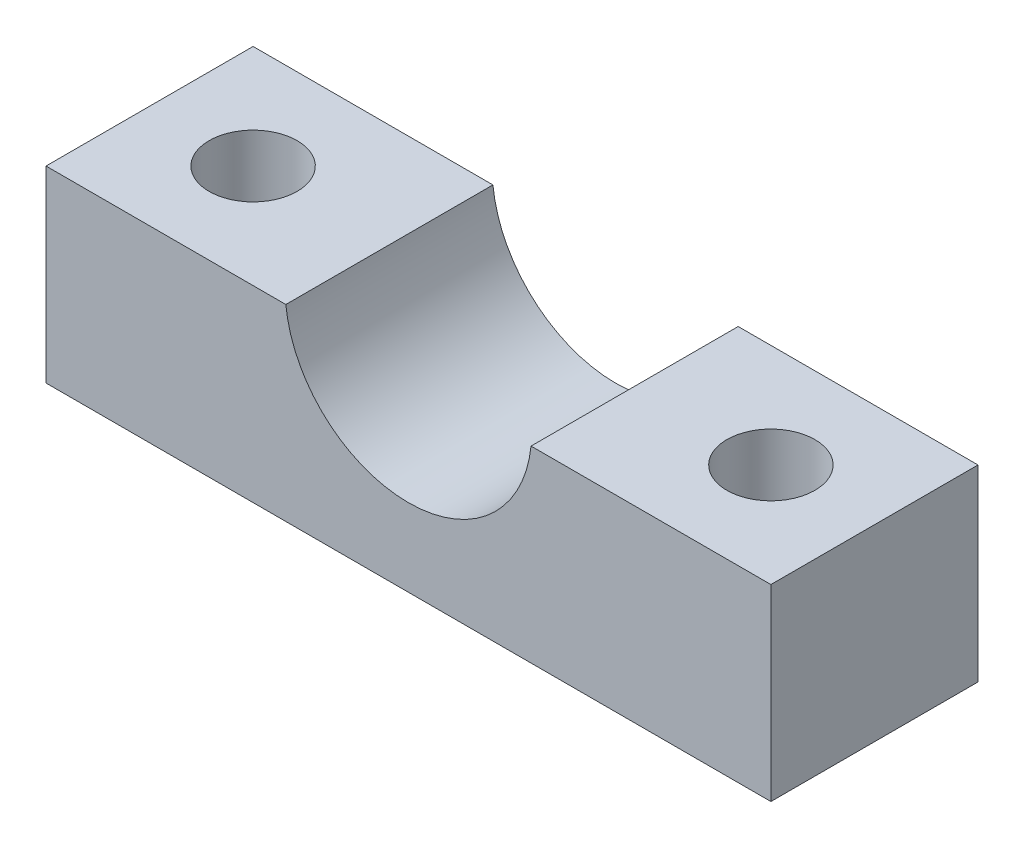
ISO-10303-21;
HEADER;
FILE_DESCRIPTION(('STEP AP214'),'2;1');
FILE_NAME('part.step','',(''),(''),'','','');
FILE_SCHEMA(('AUTOMOTIVE_DESIGN { 1 0 10303 214 1 1 1 1 }'));
ENDSEC;
DATA;
#1=APPLICATION_CONTEXT('core data for automotive mechanical design processes');
#2=APPLICATION_PROTOCOL_DEFINITION('international standard','automotive_design',2000,#1);
#3=PRODUCT_CONTEXT('',#1,'mechanical');
#4=PRODUCT('Part','Part','',(#3));
#5=PRODUCT_RELATED_PRODUCT_CATEGORY('part','',(#4));
#6=PRODUCT_DEFINITION_FORMATION('','',#4);
#7=PRODUCT_DEFINITION_CONTEXT('part definition',#1,'design');
#8=PRODUCT_DEFINITION('design','',#6,#7);
#9=PRODUCT_DEFINITION_SHAPE('','',#8);
#10=(LENGTH_UNIT() NAMED_UNIT(*) SI_UNIT(.MILLI.,.METRE.));
#11=(NAMED_UNIT(*) PLANE_ANGLE_UNIT() SI_UNIT($,.RADIAN.));
#12=(NAMED_UNIT(*) SI_UNIT($,.STERADIAN.) SOLID_ANGLE_UNIT());
#13=UNCERTAINTY_MEASURE_WITH_UNIT(LENGTH_MEASURE(1.E-05),#10,'distance_accuracy_value','');
#14=(GEOMETRIC_REPRESENTATION_CONTEXT(3) GLOBAL_UNCERTAINTY_ASSIGNED_CONTEXT((#13)) GLOBAL_UNIT_ASSIGNED_CONTEXT((#10,
#11,#12)) REPRESENTATION_CONTEXT('',''));
#15=CARTESIAN_POINT('',(0.,0.,0.));
#16=DIRECTION('',(0.,0.,1.));
#17=DIRECTION('',(1.,0.,0.));
#18=AXIS2_PLACEMENT_3D('',#15,#16,#17);
#19=CARTESIAN_POINT('',(10.,-7.76,0.));
#20=DIRECTION('',(0.,-1.,0.));
#21=DIRECTION('',(0.,0.,-1.));
#22=AXIS2_PLACEMENT_3D('',#19,#20,#21);
#23=CYLINDRICAL_SURFACE('',#22,1.69999999999999);
#24=CARTESIAN_POINT('',(10.,-0.499999999999995,0.));
#25=DIRECTION('',(0.,-1.,0.));
#26=DIRECTION('',(0.,0.,-1.));
#27=AXIS2_PLACEMENT_3D('',#24,#25,#26);
#28=CIRCLE('',#27,1.7);
#29=CARTESIAN_POINT('',(10.,-0.499999999999995,-1.7));
#30=VERTEX_POINT('',#29);
#31=EDGE_CURVE('E263',#30,#30,#28,.T.);
#32=ORIENTED_EDGE('',*,*,#31,.F.);
#33=EDGE_LOOP('',(#32));
#34=FACE_BOUND('',#33,.T.);
#35=CARTESIAN_POINT('',(10.,-4.76,0.));
#36=DIRECTION('',(0.,-1.,0.));
#37=DIRECTION('',(0.,0.,-1.));
#38=AXIS2_PLACEMENT_3D('',#35,#36,#37);
#39=CIRCLE('',#38,1.69999999999999);
#40=CARTESIAN_POINT('',(10.,-4.76,-1.69999999999999));
#41=VERTEX_POINT('',#40);
#42=EDGE_CURVE('E35',#41,#41,#39,.F.);
#43=ORIENTED_EDGE('',*,*,#42,.F.);
#44=EDGE_LOOP('',(#43));
#45=FACE_BOUND('',#44,.T.);
#46=ADVANCED_FACE('F31',(#34,#45),#23,.F.);
#47=CARTESIAN_POINT('',(-10.,-7.76,0.));
#48=DIRECTION('',(0.,-1.,0.));
#49=DIRECTION('',(0.,0.,-1.));
#50=AXIS2_PLACEMENT_3D('',#47,#48,#49);
#51=CYLINDRICAL_SURFACE('',#50,1.69999999999999);
#52=CARTESIAN_POINT('',(-10.,-0.499999999999997,0.));
#53=DIRECTION('',(0.,-1.,0.));
#54=DIRECTION('',(0.,0.,-1.));
#55=AXIS2_PLACEMENT_3D('',#52,#53,#54);
#56=CIRCLE('',#55,1.7);
#57=CARTESIAN_POINT('',(-10.,-0.499999999999997,-1.7));
#58=VERTEX_POINT('',#57);
#59=EDGE_CURVE('E260',#58,#58,#56,.T.);
#60=ORIENTED_EDGE('',*,*,#59,.F.);
#61=EDGE_LOOP('',(#60));
#62=FACE_BOUND('',#61,.T.);
#63=CARTESIAN_POINT('',(-10.,-4.76,0.));
#64=DIRECTION('',(0.,-1.,0.));
#65=DIRECTION('',(0.,0.,-1.));
#66=AXIS2_PLACEMENT_3D('',#63,#64,#65);
#67=CIRCLE('',#66,1.69999999999999);
#68=CARTESIAN_POINT('',(-10.,-4.76,-1.69999999999999));
#69=VERTEX_POINT('',#68);
#70=EDGE_CURVE('E250',#69,#69,#67,.F.);
#71=ORIENTED_EDGE('',*,*,#70,.F.);
#72=EDGE_LOOP('',(#71));
#73=FACE_BOUND('',#72,.T.);
#74=ADVANCED_FACE('F310',(#62,#73),#51,.F.);
#75=CARTESIAN_POINT('',(14.,-0.499999999999998,4.));
#76=DIRECTION('',(-1.,0.,0.));
#77=DIRECTION('',(0.,-1.,0.));
#78=AXIS2_PLACEMENT_3D('',#75,#76,#77);
#79=PLANE('',#78);
#80=DIRECTION('',(0.,1.,0.));
#81=VECTOR('',#80,1.);
#82=CARTESIAN_POINT('',(14.,-0.499999999999998,-4.));
#83=LINE('',#82,#81);
#84=CARTESIAN_POINT('',(14.,-7.76,-4.));
#85=VERTEX_POINT('',#84);
#86=CARTESIAN_POINT('',(14.,-0.499999999999998,-4.));
#87=VERTEX_POINT('',#86);
#88=EDGE_CURVE('E266',#85,#87,#83,.T.);
#89=ORIENTED_EDGE('',*,*,#88,.T.);
#90=DIRECTION('',(0.,0.,-1.));
#91=VECTOR('',#90,1.);
#92=CARTESIAN_POINT('',(14.,-0.499999999999998,4.));
#93=LINE('',#92,#91);
#94=CARTESIAN_POINT('',(14.,-0.499999999999998,4.));
#95=VERTEX_POINT('',#94);
#96=EDGE_CURVE('E11',#95,#87,#93,.T.);
#97=ORIENTED_EDGE('',*,*,#96,.F.);
#98=DIRECTION('',(0.,1.,0.));
#99=VECTOR('',#98,1.);
#100=CARTESIAN_POINT('',(14.,-0.499999999999998,4.));
#101=LINE('',#100,#99);
#102=CARTESIAN_POINT('',(14.,-7.76,4.));
#103=VERTEX_POINT('',#102);
#104=EDGE_CURVE('E267',#103,#95,#101,.T.);
#105=ORIENTED_EDGE('',*,*,#104,.F.);
#106=DIRECTION('',(0.,0.,-1.));
#107=VECTOR('',#106,1.);
#108=CARTESIAN_POINT('',(14.,-7.76,4.));
#109=LINE('',#108,#107);
#110=EDGE_CURVE('E281',#103,#85,#109,.T.);
#111=ORIENTED_EDGE('',*,*,#110,.T.);
#112=EDGE_LOOP('',(#89,#97,#105,#111));
#113=FACE_BOUND('',#112,.T.);
#114=ADVANCED_FACE('F33',(#113),#79,.F.);
#115=CARTESIAN_POINT('',(14.,-0.499999999999998,4.));
#116=DIRECTION('',(0.,-1.,0.));
#117=DIRECTION('',(1.,0.,0.));
#118=AXIS2_PLACEMENT_3D('',#115,#116,#117);
#119=PLANE('',#118);
#120=ORIENTED_EDGE('',*,*,#31,.T.);
#121=EDGE_LOOP('',(#120));
#122=FACE_BOUND('',#121,.T.);
#123=DIRECTION('',(-1.,0.,0.));
#124=VECTOR('',#123,1.);
#125=CARTESIAN_POINT('',(14.,-0.499999999999998,-4.));
#126=LINE('',#125,#124);
#127=CARTESIAN_POINT('',(4.73618055504644,-0.499999999999999,-4.));
#128=VERTEX_POINT('',#127);
#129=EDGE_CURVE('E284',#87,#128,#126,.T.);
#130=ORIENTED_EDGE('',*,*,#129,.T.);
#131=DIRECTION('',(0.,0.,-1.));
#132=VECTOR('',#131,1.);
#133=CARTESIAN_POINT('',(4.73618055504644,-0.499999999999999,4.));
#134=LINE('',#133,#132);
#135=CARTESIAN_POINT('',(4.73618055504644,-0.499999999999999,4.));
#136=VERTEX_POINT('',#135);
#137=EDGE_CURVE('E40',#136,#128,#134,.T.);
#138=ORIENTED_EDGE('',*,*,#137,.F.);
#139=DIRECTION('',(-1.,0.,0.));
#140=VECTOR('',#139,1.);
#141=CARTESIAN_POINT('',(14.,-0.499999999999998,4.));
#142=LINE('',#141,#140);
#143=EDGE_CURVE('E270',#95,#136,#142,.T.);
#144=ORIENTED_EDGE('',*,*,#143,.F.);
#145=ORIENTED_EDGE('',*,*,#96,.T.);
#146=EDGE_LOOP('',(#130,#138,#144,#145));
#147=FACE_BOUND('',#146,.T.);
#148=ADVANCED_FACE('F318',(#122,#147),#119,.F.);
#149=CARTESIAN_POINT('',(0.,0.,4.));
#150=DIRECTION('',(0.,0.,-1.));
#151=DIRECTION('',(-1.,0.,0.));
#152=AXIS2_PLACEMENT_3D('',#149,#150,#151);
#153=CYLINDRICAL_SURFACE('',#152,4.7625);
#154=CARTESIAN_POINT('',(0.,0.,-4.));
#155=DIRECTION('',(0.,0.,-1.));
#156=DIRECTION('',(1.,0.,0.));
#157=AXIS2_PLACEMENT_3D('',#154,#155,#156);
#158=CIRCLE('',#157,4.7625);
#159=CARTESIAN_POINT('',(-4.73618055504644,-0.5,-4.));
#160=VERTEX_POINT('',#159);
#161=EDGE_CURVE('E286',#128,#160,#158,.T.);
#162=ORIENTED_EDGE('',*,*,#161,.T.);
#163=DIRECTION('',(0.,0.,-1.));
#164=VECTOR('',#163,1.);
#165=CARTESIAN_POINT('',(-4.73618055504644,-0.5,4.));
#166=LINE('',#165,#164);
#167=CARTESIAN_POINT('',(-4.73618055504644,-0.5,4.));
#168=VERTEX_POINT('',#167);
#169=EDGE_CURVE('E301',#168,#160,#166,.T.);
#170=ORIENTED_EDGE('',*,*,#169,.F.);
#171=CARTESIAN_POINT('',(0.,0.,4.));
#172=DIRECTION('',(0.,0.,-1.));
#173=DIRECTION('',(1.,0.,0.));
#174=AXIS2_PLACEMENT_3D('',#171,#172,#173);
#175=CIRCLE('',#174,4.7625);
#176=EDGE_CURVE('E273',#136,#168,#175,.T.);
#177=ORIENTED_EDGE('',*,*,#176,.F.);
#178=ORIENTED_EDGE('',*,*,#137,.T.);
#179=EDGE_LOOP('',(#162,#170,#177,#178));
#180=FACE_BOUND('',#179,.T.);
#181=ADVANCED_FACE('F346',(#180),#153,.F.);
#182=CARTESIAN_POINT('',(-4.73618055504644,-0.500000000000001,4.));
#183=DIRECTION('',(0.,-1.,0.));
#184=DIRECTION('',(1.,0.,0.));
#185=AXIS2_PLACEMENT_3D('',#182,#183,#184);
#186=PLANE('',#185);
#187=ORIENTED_EDGE('',*,*,#59,.T.);
#188=EDGE_LOOP('',(#187));
#189=FACE_BOUND('',#188,.T.);
#190=DIRECTION('',(-1.,0.,0.));
#191=VECTOR('',#190,1.);
#192=CARTESIAN_POINT('',(-4.73618055504644,-0.500000000000001,-4.));
#193=LINE('',#192,#191);
#194=CARTESIAN_POINT('',(-14.,-0.500000000000002,-4.));
#195=VERTEX_POINT('',#194);
#196=EDGE_CURVE('E288',#160,#195,#193,.T.);
#197=ORIENTED_EDGE('',*,*,#196,.T.);
#198=DIRECTION('',(0.,0.,-1.));
#199=VECTOR('',#198,1.);
#200=CARTESIAN_POINT('',(-14.,-0.500000000000002,4.));
#201=LINE('',#200,#199);
#202=CARTESIAN_POINT('',(-14.,-0.500000000000002,4.));
#203=VERTEX_POINT('',#202);
#204=EDGE_CURVE('E298',#203,#195,#201,.T.);
#205=ORIENTED_EDGE('',*,*,#204,.F.);
#206=DIRECTION('',(-1.,0.,0.));
#207=VECTOR('',#206,1.);
#208=CARTESIAN_POINT('',(-4.73618055504644,-0.500000000000001,4.));
#209=LINE('',#208,#207);
#210=EDGE_CURVE('E275',#168,#203,#209,.T.);
#211=ORIENTED_EDGE('',*,*,#210,.F.);
#212=ORIENTED_EDGE('',*,*,#169,.T.);
#213=EDGE_LOOP('',(#197,#205,#211,#212));
#214=FACE_BOUND('',#213,.T.);
#215=ADVANCED_FACE('F342',(#189,#214),#186,.F.);
#216=CARTESIAN_POINT('',(-14.,-0.500000000000002,4.));
#217=DIRECTION('',(1.,0.,0.));
#218=DIRECTION('',(0.,0.,-1.));
#219=AXIS2_PLACEMENT_3D('',#216,#217,#218);
#220=PLANE('',#219);
#221=DIRECTION('',(0.,-1.,0.));
#222=VECTOR('',#221,1.);
#223=CARTESIAN_POINT('',(-14.,-0.500000000000002,-4.));
#224=LINE('',#223,#222);
#225=CARTESIAN_POINT('',(-14.,-7.76,-4.));
#226=VERTEX_POINT('',#225);
#227=EDGE_CURVE('E290',#195,#226,#224,.T.);
#228=ORIENTED_EDGE('',*,*,#227,.T.);
#229=DIRECTION('',(0.,0.,-1.));
#230=VECTOR('',#229,1.);
#231=CARTESIAN_POINT('',(-14.,-7.76,4.));
#232=LINE('',#231,#230);
#233=CARTESIAN_POINT('',(-14.,-7.76,4.));
#234=VERTEX_POINT('',#233);
#235=EDGE_CURVE('E295',#234,#226,#232,.T.);
#236=ORIENTED_EDGE('',*,*,#235,.F.);
#237=DIRECTION('',(0.,-1.,0.));
#238=VECTOR('',#237,1.);
#239=CARTESIAN_POINT('',(-14.,-0.500000000000002,4.));
#240=LINE('',#239,#238);
#241=EDGE_CURVE('E277',#203,#234,#240,.T.);
#242=ORIENTED_EDGE('',*,*,#241,.F.);
#243=ORIENTED_EDGE('',*,*,#204,.T.);
#244=EDGE_LOOP('',(#228,#236,#242,#243));
#245=FACE_BOUND('',#244,.T.);
#246=ADVANCED_FACE('F338',(#245),#220,.F.);
#247=CARTESIAN_POINT('',(14.,-7.76,4.));
#248=DIRECTION('',(0.,1.,0.));
#249=DIRECTION('',(-1.,0.,0.));
#250=AXIS2_PLACEMENT_3D('',#247,#248,#249);
#251=PLANE('',#250);
#252=DIRECTION('',(0.866025403784439,0.,-0.5));
#253=VECTOR('',#252,1.);
#254=CARTESIAN_POINT('',(7.25,-7.76,-1.58771324027147));
#255=LINE('',#254,#253);
#256=CARTESIAN_POINT('',(7.25,-7.76,-1.58771324027147));
#257=VERTEX_POINT('',#256);
#258=CARTESIAN_POINT('',(10.,-7.76,-3.17542648054294));
#259=VERTEX_POINT('',#258);
#260=EDGE_CURVE('E194',#257,#259,#255,.T.);
#261=ORIENTED_EDGE('',*,*,#260,.F.);
#262=DIRECTION('',(0.,0.,-1.));
#263=VECTOR('',#262,1.);
#264=CARTESIAN_POINT('',(7.25,-7.76,1.58771324027147));
#265=LINE('',#264,#263);
#266=CARTESIAN_POINT('',(7.25,-7.76,1.58771324027147));
#267=VERTEX_POINT('',#266);
#268=EDGE_CURVE('E48',#267,#257,#265,.T.);
#269=ORIENTED_EDGE('',*,*,#268,.F.);
#270=DIRECTION('',(-0.866025403784438,0.,-0.5));
#271=VECTOR('',#270,1.);
#272=CARTESIAN_POINT('',(10.,-7.76,3.17542648054294));
#273=LINE('',#272,#271);
#274=CARTESIAN_POINT('',(10.,-7.76,3.17542648054294));
#275=VERTEX_POINT('',#274);
#276=EDGE_CURVE('E180',#275,#267,#273,.T.);
#277=ORIENTED_EDGE('',*,*,#276,.F.);
#278=DIRECTION('',(-0.866025403784439,0.,0.5));
#279=VECTOR('',#278,1.);
#280=CARTESIAN_POINT('',(12.75,-7.76,1.58771324027147));
#281=LINE('',#280,#279);
#282=CARTESIAN_POINT('',(12.75,-7.76,1.58771324027147));
#283=VERTEX_POINT('',#282);
#284=EDGE_CURVE('E183',#283,#275,#281,.T.);
#285=ORIENTED_EDGE('',*,*,#284,.F.);
#286=DIRECTION('',(0.,0.,1.));
#287=VECTOR('',#286,1.);
#288=CARTESIAN_POINT('',(12.75,-7.76,-1.58771324027147));
#289=LINE('',#288,#287);
#290=CARTESIAN_POINT('',(12.75,-7.76,-1.58771324027147));
#291=VERTEX_POINT('',#290);
#292=EDGE_CURVE('E199',#291,#283,#289,.T.);
#293=ORIENTED_EDGE('',*,*,#292,.F.);
#294=DIRECTION('',(0.866025403784439,0.,0.5));
#295=VECTOR('',#294,1.);
#296=CARTESIAN_POINT('',(10.,-7.76,-3.17542648054294));
#297=LINE('',#296,#295);
#298=EDGE_CURVE('E196',#259,#291,#297,.T.);
#299=ORIENTED_EDGE('',*,*,#298,.F.);
#300=EDGE_LOOP('',(#261,#269,#277,#285,#293,#299));
#301=FACE_BOUND('',#300,.T.);
#302=DIRECTION('',(0.,0.,1.));
#303=VECTOR('',#302,1.);
#304=CARTESIAN_POINT('',(-7.25,-7.76,-1.58771324027147));
#305=LINE('',#304,#303);
#306=CARTESIAN_POINT('',(-7.25,-7.76,-1.58771324027147));
#307=VERTEX_POINT('',#306);
#308=CARTESIAN_POINT('',(-7.25,-7.76,1.58771324027147));
#309=VERTEX_POINT('',#308);
#310=EDGE_CURVE('E234',#307,#309,#305,.T.);
#311=ORIENTED_EDGE('',*,*,#310,.F.);
#312=DIRECTION('',(0.866025403784438,0.,0.5));
#313=VECTOR('',#312,1.);
#314=CARTESIAN_POINT('',(-10.,-7.76,-3.17542648054294));
#315=LINE('',#314,#313);
#316=CARTESIAN_POINT('',(-10.,-7.76,-3.17542648054294));
#317=VERTEX_POINT('',#316);
#318=EDGE_CURVE('E56',#317,#307,#315,.T.);
#319=ORIENTED_EDGE('',*,*,#318,.F.);
#320=DIRECTION('',(0.866025403784438,0.,-0.5));
#321=VECTOR('',#320,1.);
#322=CARTESIAN_POINT('',(-12.75,-7.76,-1.58771324027147));
#323=LINE('',#322,#321);
#324=CARTESIAN_POINT('',(-12.75,-7.76,-1.58771324027147));
#325=VERTEX_POINT('',#324);
#326=EDGE_CURVE('E217',#325,#317,#323,.T.);
#327=ORIENTED_EDGE('',*,*,#326,.F.);
#328=DIRECTION('',(0.,0.,-1.));
#329=VECTOR('',#328,1.);
#330=CARTESIAN_POINT('',(-12.75,-7.76,1.58771324027147));
#331=LINE('',#330,#329);
#332=CARTESIAN_POINT('',(-12.75,-7.76,1.58771324027147));
#333=VERTEX_POINT('',#332);
#334=EDGE_CURVE('E243',#333,#325,#331,.T.);
#335=ORIENTED_EDGE('',*,*,#334,.F.);
#336=DIRECTION('',(-0.866025403784438,0.,-0.5));
#337=VECTOR('',#336,1.);
#338=CARTESIAN_POINT('',(-10.,-7.76,3.17542648054294));
#339=LINE('',#338,#337);
#340=CARTESIAN_POINT('',(-10.,-7.76,3.17542648054294));
#341=VERTEX_POINT('',#340);
#342=EDGE_CURVE('E240',#341,#333,#339,.T.);
#343=ORIENTED_EDGE('',*,*,#342,.F.);
#344=DIRECTION('',(-0.866025403784438,0.,0.5));
#345=VECTOR('',#344,1.);
#346=CARTESIAN_POINT('',(-7.25,-7.76,1.58771324027147));
#347=LINE('',#346,#345);
#348=EDGE_CURVE('E237',#309,#341,#347,.T.);
#349=ORIENTED_EDGE('',*,*,#348,.F.);
#350=EDGE_LOOP('',(#311,#319,#327,#335,#343,#349));
#351=FACE_BOUND('',#350,.T.);
#352=DIRECTION('',(1.,0.,0.));
#353=VECTOR('',#352,1.);
#354=CARTESIAN_POINT('',(14.,-7.76,-4.));
#355=LINE('',#354,#353);
#356=EDGE_CURVE('E271',#226,#85,#355,.T.);
#357=ORIENTED_EDGE('',*,*,#356,.T.);
#358=ORIENTED_EDGE('',*,*,#110,.F.);
#359=DIRECTION('',(1.,0.,0.));
#360=VECTOR('',#359,1.);
#361=CARTESIAN_POINT('',(14.,-7.76,4.));
#362=LINE('',#361,#360);
#363=EDGE_CURVE('E279',#234,#103,#362,.T.);
#364=ORIENTED_EDGE('',*,*,#363,.F.);
#365=ORIENTED_EDGE('',*,*,#235,.T.);
#366=EDGE_LOOP('',(#357,#358,#364,#365));
#367=FACE_BOUND('',#366,.T.);
#368=ADVANCED_FACE('F331',(#301,#351,#367),#251,.F.);
#369=CARTESIAN_POINT('',(0.,0.,4.));
#370=DIRECTION('',(0.,0.,1.));
#371=DIRECTION('',(1.,0.,0.));
#372=AXIS2_PLACEMENT_3D('',#369,#370,#371);
#373=PLANE('',#372);
#374=ORIENTED_EDGE('',*,*,#104,.T.);
#375=ORIENTED_EDGE('',*,*,#143,.T.);
#376=ORIENTED_EDGE('',*,*,#176,.T.);
#377=ORIENTED_EDGE('',*,*,#210,.T.);
#378=ORIENTED_EDGE('',*,*,#241,.T.);
#379=ORIENTED_EDGE('',*,*,#363,.T.);
#380=EDGE_LOOP('',(#374,#375,#376,#377,#378,#379));
#381=FACE_BOUND('',#380,.T.);
#382=ADVANCED_FACE('F327',(#381),#373,.T.);
#383=CARTESIAN_POINT('',(0.,0.,-4.));
#384=DIRECTION('',(0.,0.,1.));
#385=DIRECTION('',(1.,0.,0.));
#386=AXIS2_PLACEMENT_3D('',#383,#384,#385);
#387=PLANE('',#386);
#388=ORIENTED_EDGE('',*,*,#88,.F.);
#389=ORIENTED_EDGE('',*,*,#356,.F.);
#390=ORIENTED_EDGE('',*,*,#227,.F.);
#391=ORIENTED_EDGE('',*,*,#196,.F.);
#392=ORIENTED_EDGE('',*,*,#161,.F.);
#393=ORIENTED_EDGE('',*,*,#129,.F.);
#394=EDGE_LOOP('',(#388,#389,#390,#391,#392,#393));
#395=FACE_BOUND('',#394,.T.);
#396=ADVANCED_FACE('F330',(#395),#387,.F.);
#397=CARTESIAN_POINT('',(-7.25,-4.76,-1.58771324027147));
#398=DIRECTION('',(0.,-1.,0.));
#399=DIRECTION('',(0.,0.,-1.));
#400=AXIS2_PLACEMENT_3D('',#397,#398,#399);
#401=PLANE('',#400);
#402=DIRECTION('',(0.866025403784438,0.,0.5));
#403=VECTOR('',#402,1.);
#404=CARTESIAN_POINT('',(-10.,-4.76,-3.17542648054294));
#405=LINE('',#404,#403);
#406=CARTESIAN_POINT('',(-10.,-4.76,-3.17542648054294));
#407=VERTEX_POINT('',#406);
#408=CARTESIAN_POINT('',(-7.25,-4.76,-1.58771324027147));
#409=VERTEX_POINT('',#408);
#410=EDGE_CURVE('E213',#407,#409,#405,.T.);
#411=ORIENTED_EDGE('',*,*,#410,.T.);
#412=DIRECTION('',(0.,0.,1.));
#413=VECTOR('',#412,1.);
#414=CARTESIAN_POINT('',(-7.25,-4.76,-1.58771324027147));
#415=LINE('',#414,#413);
#416=CARTESIAN_POINT('',(-7.25,-4.76,1.58771324027147));
#417=VERTEX_POINT('',#416);
#418=EDGE_CURVE('E216',#409,#417,#415,.T.);
#419=ORIENTED_EDGE('',*,*,#418,.T.);
#420=DIRECTION('',(-0.866025403784438,0.,0.5));
#421=VECTOR('',#420,1.);
#422=CARTESIAN_POINT('',(-7.25,-4.76,1.58771324027147));
#423=LINE('',#422,#421);
#424=CARTESIAN_POINT('',(-10.,-4.76,3.17542648054294));
#425=VERTEX_POINT('',#424);
#426=EDGE_CURVE('E220',#417,#425,#423,.T.);
#427=ORIENTED_EDGE('',*,*,#426,.T.);
#428=DIRECTION('',(-0.866025403784438,0.,-0.5));
#429=VECTOR('',#428,1.);
#430=CARTESIAN_POINT('',(-10.,-4.76,3.17542648054294));
#431=LINE('',#430,#429);
#432=CARTESIAN_POINT('',(-12.75,-4.76,1.58771324027147));
#433=VERTEX_POINT('',#432);
#434=EDGE_CURVE('E223',#425,#433,#431,.T.);
#435=ORIENTED_EDGE('',*,*,#434,.T.);
#436=DIRECTION('',(0.,0.,-1.));
#437=VECTOR('',#436,1.);
#438=CARTESIAN_POINT('',(-12.75,-4.76,1.58771324027147));
#439=LINE('',#438,#437);
#440=CARTESIAN_POINT('',(-12.75,-4.76,-1.58771324027147));
#441=VERTEX_POINT('',#440);
#442=EDGE_CURVE('E226',#433,#441,#439,.T.);
#443=ORIENTED_EDGE('',*,*,#442,.T.);
#444=DIRECTION('',(0.866025403784438,0.,-0.5));
#445=VECTOR('',#444,1.);
#446=CARTESIAN_POINT('',(-12.75,-4.76,-1.58771324027147));
#447=LINE('',#446,#445);
#448=EDGE_CURVE('E229',#441,#407,#447,.T.);
#449=ORIENTED_EDGE('',*,*,#448,.T.);
#450=EDGE_LOOP('',(#411,#419,#427,#435,#443,#449));
#451=FACE_BOUND('',#450,.T.);
#452=ORIENTED_EDGE('',*,*,#70,.T.);
#453=EDGE_LOOP('',(#452));
#454=FACE_BOUND('',#453,.T.);
#455=ADVANCED_FACE('F308',(#451,#454),#401,.T.);
#456=CARTESIAN_POINT('',(-10.,-4.76,-3.17542648054294));
#457=DIRECTION('',(0.5,0.,-0.866025403784438));
#458=DIRECTION('',(-0.866025403784438,0.,-0.5));
#459=AXIS2_PLACEMENT_3D('',#456,#457,#458);
#460=PLANE('',#459);
#461=ORIENTED_EDGE('',*,*,#318,.T.);
#462=DIRECTION('',(0.,-1.,0.));
#463=VECTOR('',#462,1.);
#464=CARTESIAN_POINT('',(-7.25,-4.76,-1.58771324027147));
#465=LINE('',#464,#463);
#466=EDGE_CURVE('E232',#409,#307,#465,.T.);
#467=ORIENTED_EDGE('',*,*,#466,.F.);
#468=ORIENTED_EDGE('',*,*,#410,.F.);
#469=DIRECTION('',(0.,-1.,0.));
#470=VECTOR('',#469,1.);
#471=CARTESIAN_POINT('',(-10.,-4.76,-3.17542648054294));
#472=LINE('',#471,#470);
#473=EDGE_CURVE('E248',#407,#317,#472,.T.);
#474=ORIENTED_EDGE('',*,*,#473,.T.);
#475=EDGE_LOOP('',(#461,#467,#468,#474));
#476=FACE_BOUND('',#475,.T.);
#477=ADVANCED_FACE('F324',(#476),#460,.F.);
#478=CARTESIAN_POINT('',(-12.75,-4.76,-1.58771324027147));
#479=DIRECTION('',(-0.5,0.,-0.866025403784439));
#480=DIRECTION('',(-0.866025403784439,0.,0.5));
#481=AXIS2_PLACEMENT_3D('',#478,#479,#480);
#482=PLANE('',#481);
#483=ORIENTED_EDGE('',*,*,#326,.T.);
#484=ORIENTED_EDGE('',*,*,#473,.F.);
#485=ORIENTED_EDGE('',*,*,#448,.F.);
#486=DIRECTION('',(0.,-1.,0.));
#487=VECTOR('',#486,1.);
#488=CARTESIAN_POINT('',(-12.75,-4.76,-1.58771324027147));
#489=LINE('',#488,#487);
#490=EDGE_CURVE('E251',#441,#325,#489,.T.);
#491=ORIENTED_EDGE('',*,*,#490,.T.);
#492=EDGE_LOOP('',(#483,#484,#485,#491));
#493=FACE_BOUND('',#492,.T.);
#494=ADVANCED_FACE('F409',(#493),#482,.F.);
#495=CARTESIAN_POINT('',(-12.75,-4.76,1.58771324027147));
#496=DIRECTION('',(-1.,0.,0.));
#497=DIRECTION('',(0.,-1.,0.));
#498=AXIS2_PLACEMENT_3D('',#495,#496,#497);
#499=PLANE('',#498);
#500=ORIENTED_EDGE('',*,*,#334,.T.);
#501=ORIENTED_EDGE('',*,*,#490,.F.);
#502=ORIENTED_EDGE('',*,*,#442,.F.);
#503=DIRECTION('',(0.,-1.,0.));
#504=VECTOR('',#503,1.);
#505=CARTESIAN_POINT('',(-12.75,-4.76,1.58771324027147));
#506=LINE('',#505,#504);
#507=EDGE_CURVE('E253',#433,#333,#506,.T.);
#508=ORIENTED_EDGE('',*,*,#507,.T.);
#509=EDGE_LOOP('',(#500,#501,#502,#508));
#510=FACE_BOUND('',#509,.T.);
#511=ADVANCED_FACE('F412',(#510),#499,.F.);
#512=CARTESIAN_POINT('',(-10.,-4.76,3.17542648054294));
#513=DIRECTION('',(-0.5,0.,0.866025403784438));
#514=DIRECTION('',(0.866025403784438,0.,0.5));
#515=AXIS2_PLACEMENT_3D('',#512,#513,#514);
#516=PLANE('',#515);
#517=ORIENTED_EDGE('',*,*,#342,.T.);
#518=ORIENTED_EDGE('',*,*,#507,.F.);
#519=ORIENTED_EDGE('',*,*,#434,.F.);
#520=DIRECTION('',(0.,-1.,0.));
#521=VECTOR('',#520,1.);
#522=CARTESIAN_POINT('',(-10.,-4.76,3.17542648054294));
#523=LINE('',#522,#521);
#524=EDGE_CURVE('E255',#425,#341,#523,.T.);
#525=ORIENTED_EDGE('',*,*,#524,.T.);
#526=EDGE_LOOP('',(#517,#518,#519,#525));
#527=FACE_BOUND('',#526,.T.);
#528=ADVANCED_FACE('F416',(#527),#516,.F.);
#529=CARTESIAN_POINT('',(-7.25,-4.76,1.58771324027147));
#530=DIRECTION('',(0.5,0.,0.866025403784439));
#531=DIRECTION('',(0.866025403784439,0.,-0.5));
#532=AXIS2_PLACEMENT_3D('',#529,#530,#531);
#533=PLANE('',#532);
#534=ORIENTED_EDGE('',*,*,#348,.T.);
#535=ORIENTED_EDGE('',*,*,#524,.F.);
#536=ORIENTED_EDGE('',*,*,#426,.F.);
#537=DIRECTION('',(0.,-1.,0.));
#538=VECTOR('',#537,1.);
#539=CARTESIAN_POINT('',(-7.25,-4.76,1.58771324027147));
#540=LINE('',#539,#538);
#541=EDGE_CURVE('E257',#417,#309,#540,.T.);
#542=ORIENTED_EDGE('',*,*,#541,.T.);
#543=EDGE_LOOP('',(#534,#535,#536,#542));
#544=FACE_BOUND('',#543,.T.);
#545=ADVANCED_FACE('F386',(#544),#533,.F.);
#546=CARTESIAN_POINT('',(-7.25,-4.76,-1.58771324027147));
#547=DIRECTION('',(1.,0.,0.));
#548=DIRECTION('',(0.,1.,0.));
#549=AXIS2_PLACEMENT_3D('',#546,#547,#548);
#550=PLANE('',#549);
#551=ORIENTED_EDGE('',*,*,#310,.T.);
#552=ORIENTED_EDGE('',*,*,#541,.F.);
#553=ORIENTED_EDGE('',*,*,#418,.F.);
#554=ORIENTED_EDGE('',*,*,#466,.T.);
#555=EDGE_LOOP('',(#551,#552,#553,#554));
#556=FACE_BOUND('',#555,.T.);
#557=ADVANCED_FACE('F378',(#556),#550,.F.);
#558=CARTESIAN_POINT('',(7.25,-4.76,-1.58771324027147));
#559=DIRECTION('',(0.,-1.,0.));
#560=DIRECTION('',(0.,0.,-1.));
#561=AXIS2_PLACEMENT_3D('',#558,#559,#560);
#562=PLANE('',#561);
#563=DIRECTION('',(0.,0.,-1.));
#564=VECTOR('',#563,1.);
#565=CARTESIAN_POINT('',(7.25,-4.76,1.58771324027147));
#566=LINE('',#565,#564);
#567=CARTESIAN_POINT('',(7.25,-4.76,1.58771324027147));
#568=VERTEX_POINT('',#567);
#569=CARTESIAN_POINT('',(7.25,-4.76,-1.58771324027147));
#570=VERTEX_POINT('',#569);
#571=EDGE_CURVE('E160',#568,#570,#566,.T.);
#572=ORIENTED_EDGE('',*,*,#571,.T.);
#573=DIRECTION('',(0.866025403784439,0.,-0.5));
#574=VECTOR('',#573,1.);
#575=CARTESIAN_POINT('',(7.25,-4.76,-1.58771324027147));
#576=LINE('',#575,#574);
#577=CARTESIAN_POINT('',(10.,-4.76,-3.17542648054294));
#578=VERTEX_POINT('',#577);
#579=EDGE_CURVE('E169',#570,#578,#576,.T.);
#580=ORIENTED_EDGE('',*,*,#579,.T.);
#581=DIRECTION('',(0.866025403784439,0.,0.5));
#582=VECTOR('',#581,1.);
#583=CARTESIAN_POINT('',(10.,-4.76,-3.17542648054294));
#584=LINE('',#583,#582);
#585=CARTESIAN_POINT('',(12.75,-4.76,-1.58771324027147));
#586=VERTEX_POINT('',#585);
#587=EDGE_CURVE('E174',#578,#586,#584,.T.);
#588=ORIENTED_EDGE('',*,*,#587,.T.);
#589=DIRECTION('',(0.,0.,1.));
#590=VECTOR('',#589,1.);
#591=CARTESIAN_POINT('',(12.75,-4.76,-1.58771324027147));
#592=LINE('',#591,#590);
#593=CARTESIAN_POINT('',(12.75,-4.76,1.58771324027147));
#594=VERTEX_POINT('',#593);
#595=EDGE_CURVE('E187',#586,#594,#592,.T.);
#596=ORIENTED_EDGE('',*,*,#595,.T.);
#597=DIRECTION('',(-0.866025403784439,0.,0.5));
#598=VECTOR('',#597,1.);
#599=CARTESIAN_POINT('',(12.75,-4.76,1.58771324027147));
#600=LINE('',#599,#598);
#601=CARTESIAN_POINT('',(10.,-4.76,3.17542648054294));
#602=VERTEX_POINT('',#601);
#603=EDGE_CURVE('E190',#594,#602,#600,.T.);
#604=ORIENTED_EDGE('',*,*,#603,.T.);
#605=DIRECTION('',(-0.866025403784438,0.,-0.5));
#606=VECTOR('',#605,1.);
#607=CARTESIAN_POINT('',(10.,-4.76,3.17542648054294));
#608=LINE('',#607,#606);
#609=EDGE_CURVE('E166',#602,#568,#608,.T.);
#610=ORIENTED_EDGE('',*,*,#609,.T.);
#611=EDGE_LOOP('',(#572,#580,#588,#596,#604,#610));
#612=FACE_BOUND('',#611,.T.);
#613=ORIENTED_EDGE('',*,*,#42,.T.);
#614=EDGE_LOOP('',(#613));
#615=FACE_BOUND('',#614,.T.);
#616=ADVANCED_FACE('F176',(#612,#615),#562,.T.);
#617=CARTESIAN_POINT('',(7.25,-4.76,1.58771324027147));
#618=DIRECTION('',(-1.,0.,0.));
#619=DIRECTION('',(0.,-1.,0.));
#620=AXIS2_PLACEMENT_3D('',#617,#618,#619);
#621=PLANE('',#620);
#622=ORIENTED_EDGE('',*,*,#268,.T.);
#623=DIRECTION('',(0.,-1.,0.));
#624=VECTOR('',#623,1.);
#625=CARTESIAN_POINT('',(7.25,-4.76,-1.58771324027147));
#626=LINE('',#625,#624);
#627=EDGE_CURVE('E156',#570,#257,#626,.T.);
#628=ORIENTED_EDGE('',*,*,#627,.F.);
#629=ORIENTED_EDGE('',*,*,#571,.F.);
#630=DIRECTION('',(0.,-1.,0.));
#631=VECTOR('',#630,1.);
#632=CARTESIAN_POINT('',(7.25,-4.76,1.58771324027147));
#633=LINE('',#632,#631);
#634=EDGE_CURVE('E204',#568,#267,#633,.T.);
#635=ORIENTED_EDGE('',*,*,#634,.T.);
#636=EDGE_LOOP('',(#622,#628,#629,#635));
#637=FACE_BOUND('',#636,.T.);
#638=ADVANCED_FACE('F158',(#637),#621,.F.);
#639=CARTESIAN_POINT('',(10.,-4.76,3.17542648054294));
#640=DIRECTION('',(-0.5,0.,0.866025403784439));
#641=DIRECTION('',(0.866025403784439,0.,0.5));
#642=AXIS2_PLACEMENT_3D('',#639,#640,#641);
#643=PLANE('',#642);
#644=ORIENTED_EDGE('',*,*,#276,.T.);
#645=ORIENTED_EDGE('',*,*,#634,.F.);
#646=ORIENTED_EDGE('',*,*,#609,.F.);
#647=DIRECTION('',(0.,-1.,0.));
#648=VECTOR('',#647,1.);
#649=CARTESIAN_POINT('',(10.,-4.76,3.17542648054294));
#650=LINE('',#649,#648);
#651=EDGE_CURVE('E206',#602,#275,#650,.T.);
#652=ORIENTED_EDGE('',*,*,#651,.T.);
#653=EDGE_LOOP('',(#644,#645,#646,#652));
#654=FACE_BOUND('',#653,.T.);
#655=ADVANCED_FACE('F384',(#654),#643,.F.);
#656=CARTESIAN_POINT('',(12.75,-4.76,1.58771324027147));
#657=DIRECTION('',(0.5,0.,0.866025403784439));
#658=DIRECTION('',(0.866025403784439,0.,-0.5));
#659=AXIS2_PLACEMENT_3D('',#656,#657,#658);
#660=PLANE('',#659);
#661=ORIENTED_EDGE('',*,*,#284,.T.);
#662=ORIENTED_EDGE('',*,*,#651,.F.);
#663=ORIENTED_EDGE('',*,*,#603,.F.);
#664=DIRECTION('',(0.,-1.,0.));
#665=VECTOR('',#664,1.);
#666=CARTESIAN_POINT('',(12.75,-4.76,1.58771324027147));
#667=LINE('',#666,#665);
#668=EDGE_CURVE('E208',#594,#283,#667,.T.);
#669=ORIENTED_EDGE('',*,*,#668,.T.);
#670=EDGE_LOOP('',(#661,#662,#663,#669));
#671=FACE_BOUND('',#670,.T.);
#672=ADVANCED_FACE('F391',(#671),#660,.F.);
#673=CARTESIAN_POINT('',(12.75,-4.76,-1.58771324027147));
#674=DIRECTION('',(1.,0.,0.));
#675=DIRECTION('',(0.,1.,0.));
#676=AXIS2_PLACEMENT_3D('',#673,#674,#675);
#677=PLANE('',#676);
#678=ORIENTED_EDGE('',*,*,#292,.T.);
#679=ORIENTED_EDGE('',*,*,#668,.F.);
#680=ORIENTED_EDGE('',*,*,#595,.F.);
#681=DIRECTION('',(0.,-1.,0.));
#682=VECTOR('',#681,1.);
#683=CARTESIAN_POINT('',(12.75,-4.76,-1.58771324027147));
#684=LINE('',#683,#682);
#685=EDGE_CURVE('E210',#586,#291,#684,.T.);
#686=ORIENTED_EDGE('',*,*,#685,.T.);
#687=EDGE_LOOP('',(#678,#679,#680,#686));
#688=FACE_BOUND('',#687,.T.);
#689=ADVANCED_FACE('F395',(#688),#677,.F.);
#690=CARTESIAN_POINT('',(10.,-4.76,-3.17542648054294));
#691=DIRECTION('',(0.5,0.,-0.866025403784438));
#692=DIRECTION('',(-0.866025403784439,0.,-0.5));
#693=AXIS2_PLACEMENT_3D('',#690,#691,#692);
#694=PLANE('',#693);
#695=ORIENTED_EDGE('',*,*,#298,.T.);
#696=ORIENTED_EDGE('',*,*,#685,.F.);
#697=ORIENTED_EDGE('',*,*,#587,.F.);
#698=DIRECTION('',(0.,-1.,0.));
#699=VECTOR('',#698,1.);
#700=CARTESIAN_POINT('',(10.,-4.76,-3.17542648054294));
#701=LINE('',#700,#699);
#702=EDGE_CURVE('E165',#578,#259,#701,.T.);
#703=ORIENTED_EDGE('',*,*,#702,.T.);
#704=EDGE_LOOP('',(#695,#696,#697,#703));
#705=FACE_BOUND('',#704,.T.);
#706=ADVANCED_FACE('F399',(#705),#694,.F.);
#707=CARTESIAN_POINT('',(7.25,-4.76,-1.58771324027147));
#708=DIRECTION('',(-0.5,0.,-0.866025403784439));
#709=DIRECTION('',(-0.866025403784439,0.,0.5));
#710=AXIS2_PLACEMENT_3D('',#707,#708,#709);
#711=PLANE('',#710);
#712=ORIENTED_EDGE('',*,*,#260,.T.);
#713=ORIENTED_EDGE('',*,*,#702,.F.);
#714=ORIENTED_EDGE('',*,*,#579,.F.);
#715=ORIENTED_EDGE('',*,*,#627,.T.);
#716=EDGE_LOOP('',(#712,#713,#714,#715));
#717=FACE_BOUND('',#716,.T.);
#718=ADVANCED_FACE('F170',(#717),#711,.F.);
#719=CLOSED_SHELL('',(#46,#74,#114,#148,#181,#215,#246,#368,#382,#396,#455,#477,#494,#511,#528,
#545,#557,#616,#638,#655,#672,#689,#706,#718));
#720=MANIFOLD_SOLID_BREP('B2',#719);
#721=ADVANCED_BREP_SHAPE_REPRESENTATION('',(#18,#720),#14);
#722=SHAPE_DEFINITION_REPRESENTATION(#9,#721);
ENDSEC;
END-ISO-10303-21;
